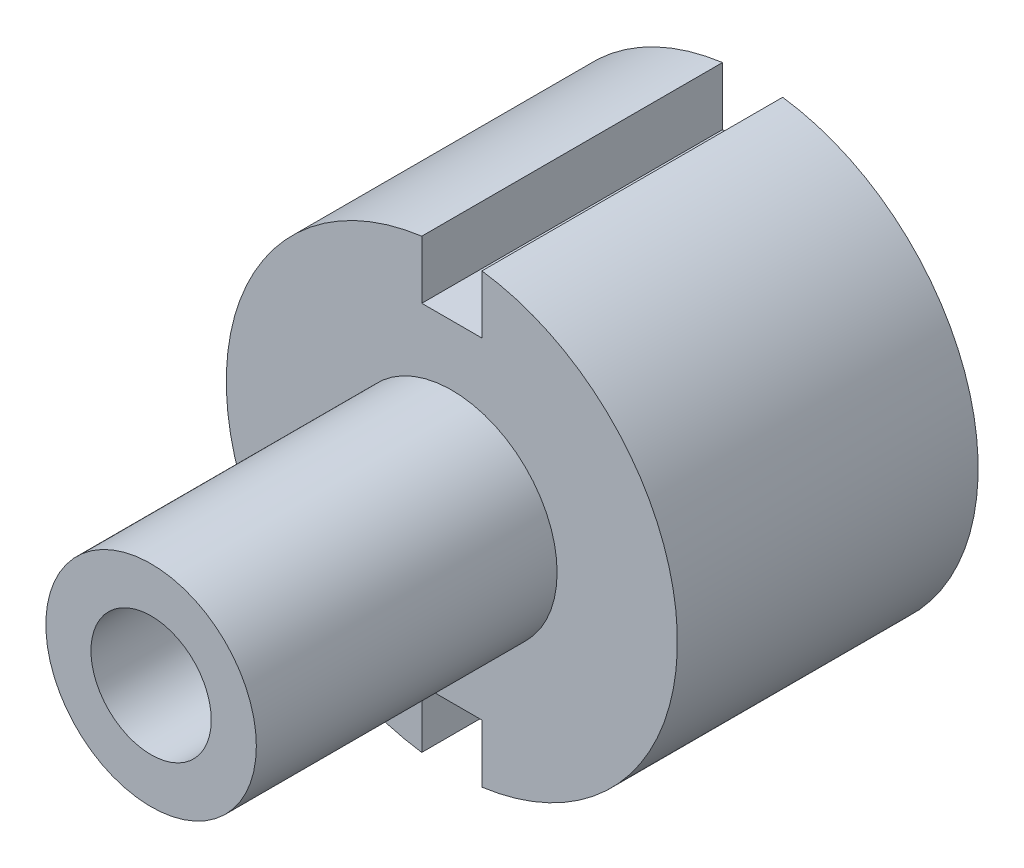
ISO-10303-21;
HEADER;
FILE_DESCRIPTION(('STEP AP214'),'2;1');
FILE_NAME('part.step','',(''),(''),'','','');
FILE_SCHEMA(('AUTOMOTIVE_DESIGN { 1 0 10303 214 1 1 1 1 }'));
ENDSEC;
DATA;
#1=APPLICATION_CONTEXT('core data for automotive mechanical design processes');
#2=APPLICATION_PROTOCOL_DEFINITION('international standard','automotive_design',2000,#1);
#3=PRODUCT_CONTEXT('',#1,'mechanical');
#4=PRODUCT('Part','Part','',(#3));
#5=PRODUCT_RELATED_PRODUCT_CATEGORY('part','',(#4));
#6=PRODUCT_DEFINITION_FORMATION('','',#4);
#7=PRODUCT_DEFINITION_CONTEXT('part definition',#1,'design');
#8=PRODUCT_DEFINITION('design','',#6,#7);
#9=PRODUCT_DEFINITION_SHAPE('','',#8);
#10=(LENGTH_UNIT() NAMED_UNIT(*) SI_UNIT(.MILLI.,.METRE.));
#11=(NAMED_UNIT(*) PLANE_ANGLE_UNIT() SI_UNIT($,.RADIAN.));
#12=(NAMED_UNIT(*) SI_UNIT($,.STERADIAN.) SOLID_ANGLE_UNIT());
#13=UNCERTAINTY_MEASURE_WITH_UNIT(LENGTH_MEASURE(1.E-05),#10,'distance_accuracy_value','');
#14=(GEOMETRIC_REPRESENTATION_CONTEXT(3) GLOBAL_UNCERTAINTY_ASSIGNED_CONTEXT((#13)) GLOBAL_UNIT_ASSIGNED_CONTEXT((#10,
#11,#12)) REPRESENTATION_CONTEXT('',''));
#15=CARTESIAN_POINT('',(0.,0.,0.));
#16=DIRECTION('',(0.,0.,1.));
#17=DIRECTION('',(1.,0.,0.));
#18=AXIS2_PLACEMENT_3D('',#15,#16,#17);
#19=CARTESIAN_POINT('',(0.,0.,5.));
#20=DIRECTION('',(0.,0.,-1.));
#21=DIRECTION('',(-1.,0.,0.));
#22=AXIS2_PLACEMENT_3D('',#19,#20,#21);
#23=CYLINDRICAL_SURFACE('',#22,7.5);
#24=CARTESIAN_POINT('',(0.,0.,5.));
#25=DIRECTION('',(0.,0.,1.));
#26=DIRECTION('',(1.,0.,0.));
#27=AXIS2_PLACEMENT_3D('',#24,#25,#26);
#28=CIRCLE('',#27,7.5);
#29=CARTESIAN_POINT('',(1.,-7.43303437365925,5.));
#30=VERTEX_POINT('',#29);
#31=CARTESIAN_POINT('',(1.,7.43303437365925,5.));
#32=VERTEX_POINT('',#31);
#33=EDGE_CURVE('E137',#30,#32,#28,.T.);
#34=ORIENTED_EDGE('',*,*,#33,.F.);
#35=DIRECTION('',(0.,0.,-1.));
#36=VECTOR('',#35,1.);
#37=CARTESIAN_POINT('',(1.,-7.43303437365925,5.));
#38=LINE('',#37,#36);
#39=CARTESIAN_POINT('',(1.,-7.43303437365925,-5.));
#40=VERTEX_POINT('',#39);
#41=EDGE_CURVE('E201',#30,#40,#38,.T.);
#42=ORIENTED_EDGE('',*,*,#41,.T.);
#43=CARTESIAN_POINT('',(0.,0.,-5.));
#44=DIRECTION('',(0.,0.,1.));
#45=DIRECTION('',(1.,0.,0.));
#46=AXIS2_PLACEMENT_3D('',#43,#44,#45);
#47=CIRCLE('',#46,7.5);
#48=CARTESIAN_POINT('',(1.,7.43303437365925,-5.));
#49=VERTEX_POINT('',#48);
#50=EDGE_CURVE('E129',#40,#49,#47,.T.);
#51=ORIENTED_EDGE('',*,*,#50,.T.);
#52=DIRECTION('',(0.,0.,-1.));
#53=VECTOR('',#52,1.);
#54=CARTESIAN_POINT('',(1.,7.43303437365925,5.));
#55=LINE('',#54,#53);
#56=EDGE_CURVE('E163',#49,#32,#55,.F.);
#57=ORIENTED_EDGE('',*,*,#56,.T.);
#58=EDGE_LOOP('',(#34,#42,#51,#57));
#59=FACE_BOUND('',#58,.T.);
#60=ADVANCED_FACE('F33',(#59),#23,.T.);
#61=CARTESIAN_POINT('',(-1.,7.43303437365925,-5.));
#62=VERTEX_POINT('',#61);
#63=CARTESIAN_POINT('',(-0.999999999999999,-7.43303437365925,-5.));
#64=VERTEX_POINT('',#63);
#65=EDGE_CURVE('E133',#62,#64,#47,.T.);
#66=ORIENTED_EDGE('',*,*,#65,.T.);
#67=DIRECTION('',(0.,0.,-1.));
#68=VECTOR('',#67,1.);
#69=CARTESIAN_POINT('',(-0.999999999999999,-7.43303437365925,5.));
#70=LINE('',#69,#68);
#71=CARTESIAN_POINT('',(-0.999999999999999,-7.43303437365925,5.));
#72=VERTEX_POINT('',#71);
#73=EDGE_CURVE('E212',#64,#72,#70,.F.);
#74=ORIENTED_EDGE('',*,*,#73,.T.);
#75=CARTESIAN_POINT('',(-1.,7.43303437365925,5.));
#76=VERTEX_POINT('',#75);
#77=EDGE_CURVE('E143',#76,#72,#28,.T.);
#78=ORIENTED_EDGE('',*,*,#77,.F.);
#79=DIRECTION('',(0.,0.,-1.));
#80=VECTOR('',#79,1.);
#81=CARTESIAN_POINT('',(-1.,7.43303437365925,5.));
#82=LINE('',#81,#80);
#83=EDGE_CURVE('E154',#76,#62,#82,.T.);
#84=ORIENTED_EDGE('',*,*,#83,.T.);
#85=EDGE_LOOP('',(#66,#74,#78,#84));
#86=FACE_BOUND('',#85,.T.);
#87=ADVANCED_FACE('F35',(#86),#23,.T.);
#88=CARTESIAN_POINT('',(0.,0.,5.));
#89=DIRECTION('',(0.,0.,1.));
#90=DIRECTION('',(1.,0.,0.));
#91=AXIS2_PLACEMENT_3D('',#88,#89,#90);
#92=PLANE('',#91);
#93=DIRECTION('',(0.,1.,0.));
#94=VECTOR('',#93,1.);
#95=CARTESIAN_POINT('',(1.,-7.5,5.));
#96=LINE('',#95,#94);
#97=CARTESIAN_POINT('',(1.,-5.5,5.));
#98=VERTEX_POINT('',#97);
#99=EDGE_CURVE('E115',#30,#98,#96,.T.);
#100=ORIENTED_EDGE('',*,*,#99,.F.);
#101=ORIENTED_EDGE('',*,*,#33,.T.);
#102=DIRECTION('',(0.,1.,0.));
#103=VECTOR('',#102,1.);
#104=CARTESIAN_POINT('',(1.,7.5,5.));
#105=LINE('',#104,#103);
#106=CARTESIAN_POINT('',(1.,5.5,5.));
#107=VERTEX_POINT('',#106);
#108=EDGE_CURVE('E210',#107,#32,#105,.T.);
#109=ORIENTED_EDGE('',*,*,#108,.F.);
#110=DIRECTION('',(1.,0.,0.));
#111=VECTOR('',#110,1.);
#112=CARTESIAN_POINT('',(-1.,5.5,5.));
#113=LINE('',#112,#111);
#114=CARTESIAN_POINT('',(-1.,5.5,5.));
#115=VERTEX_POINT('',#114);
#116=EDGE_CURVE('E208',#115,#107,#113,.T.);
#117=ORIENTED_EDGE('',*,*,#116,.F.);
#118=DIRECTION('',(0.,-1.,0.));
#119=VECTOR('',#118,1.);
#120=CARTESIAN_POINT('',(-1.,7.5,5.));
#121=LINE('',#120,#119);
#122=EDGE_CURVE('E206',#76,#115,#121,.T.);
#123=ORIENTED_EDGE('',*,*,#122,.F.);
#124=ORIENTED_EDGE('',*,*,#77,.T.);
#125=DIRECTION('',(0.,-1.,0.));
#126=VECTOR('',#125,1.);
#127=CARTESIAN_POINT('',(-0.999999999999999,-7.5,5.));
#128=LINE('',#127,#126);
#129=CARTESIAN_POINT('',(-0.999999999999999,-5.5,5.));
#130=VERTEX_POINT('',#129);
#131=EDGE_CURVE('E125',#130,#72,#128,.T.);
#132=ORIENTED_EDGE('',*,*,#131,.F.);
#133=DIRECTION('',(-1.,0.,0.));
#134=VECTOR('',#133,1.);
#135=CARTESIAN_POINT('',(1.,-5.5,5.));
#136=LINE('',#135,#134);
#137=EDGE_CURVE('E223',#98,#130,#136,.T.);
#138=ORIENTED_EDGE('',*,*,#137,.F.);
#139=EDGE_LOOP('',(#100,#101,#109,#117,#123,#124,#132,#138));
#140=FACE_BOUND('',#139,.T.);
#141=CARTESIAN_POINT('',(0.,0.,5.));
#142=DIRECTION('',(0.,0.,1.));
#143=DIRECTION('',(1.,0.,0.));
#144=AXIS2_PLACEMENT_3D('',#141,#142,#143);
#145=CIRCLE('',#144,3.5);
#146=CARTESIAN_POINT('',(3.5,0.,5.));
#147=VERTEX_POINT('',#146);
#148=EDGE_CURVE('E139',#147,#147,#145,.T.);
#149=ORIENTED_EDGE('',*,*,#148,.F.);
#150=EDGE_LOOP('',(#149));
#151=FACE_BOUND('',#150,.T.);
#152=ADVANCED_FACE('F188',(#140,#151),#92,.T.);
#153=CARTESIAN_POINT('',(0.,0.,-5.));
#154=DIRECTION('',(0.,0.,1.));
#155=DIRECTION('',(1.,0.,0.));
#156=AXIS2_PLACEMENT_3D('',#153,#154,#155);
#157=PLANE('',#156);
#158=ORIENTED_EDGE('',*,*,#50,.F.);
#159=DIRECTION('',(0.,1.,0.));
#160=VECTOR('',#159,1.);
#161=CARTESIAN_POINT('',(1.,0.,-5.));
#162=LINE('',#161,#160);
#163=CARTESIAN_POINT('',(1.,-5.5,-5.));
#164=VERTEX_POINT('',#163);
#165=EDGE_CURVE('E11',#40,#164,#162,.T.);
#166=ORIENTED_EDGE('',*,*,#165,.T.);
#167=DIRECTION('',(-1.,0.,0.));
#168=VECTOR('',#167,1.);
#169=CARTESIAN_POINT('',(1.,-5.5,-5.));
#170=LINE('',#169,#168);
#171=CARTESIAN_POINT('',(-0.999999999999999,-5.5,-5.));
#172=VERTEX_POINT('',#171);
#173=EDGE_CURVE('E122',#164,#172,#170,.T.);
#174=ORIENTED_EDGE('',*,*,#173,.T.);
#175=DIRECTION('',(0.,-1.,0.));
#176=VECTOR('',#175,1.);
#177=CARTESIAN_POINT('',(-0.999999999999999,-7.5,-5.));
#178=LINE('',#177,#176);
#179=EDGE_CURVE('E48',#172,#64,#178,.T.);
#180=ORIENTED_EDGE('',*,*,#179,.T.);
#181=ORIENTED_EDGE('',*,*,#65,.F.);
#182=DIRECTION('',(0.,-1.,0.));
#183=VECTOR('',#182,1.);
#184=CARTESIAN_POINT('',(-1.,0.,-5.));
#185=LINE('',#184,#183);
#186=CARTESIAN_POINT('',(-1.,5.5,-5.));
#187=VERTEX_POINT('',#186);
#188=EDGE_CURVE('E41',#62,#187,#185,.T.);
#189=ORIENTED_EDGE('',*,*,#188,.T.);
#190=DIRECTION('',(1.,0.,0.));
#191=VECTOR('',#190,1.);
#192=CARTESIAN_POINT('',(-1.,5.5,-5.));
#193=LINE('',#192,#191);
#194=CARTESIAN_POINT('',(1.,5.5,-5.));
#195=VERTEX_POINT('',#194);
#196=EDGE_CURVE('E150',#187,#195,#193,.T.);
#197=ORIENTED_EDGE('',*,*,#196,.T.);
#198=DIRECTION('',(0.,1.,0.));
#199=VECTOR('',#198,1.);
#200=CARTESIAN_POINT('',(1.,7.5,-5.));
#201=LINE('',#200,#199);
#202=EDGE_CURVE('E56',#195,#49,#201,.T.);
#203=ORIENTED_EDGE('',*,*,#202,.T.);
#204=EDGE_LOOP('',(#158,#166,#174,#180,#181,#189,#197,#203));
#205=FACE_BOUND('',#204,.T.);
#206=ADVANCED_FACE('F128',(#205),#157,.F.);
#207=CARTESIAN_POINT('',(0.,0.,15.));
#208=DIRECTION('',(0.,0.,-1.));
#209=DIRECTION('',(-1.,0.,0.));
#210=AXIS2_PLACEMENT_3D('',#207,#208,#209);
#211=CYLINDRICAL_SURFACE('',#210,3.5);
#212=CARTESIAN_POINT('',(0.,0.,15.));
#213=DIRECTION('',(0.,0.,1.));
#214=DIRECTION('',(1.,0.,0.));
#215=AXIS2_PLACEMENT_3D('',#212,#213,#214);
#216=CIRCLE('',#215,3.5);
#217=CARTESIAN_POINT('',(3.5,0.,15.));
#218=VERTEX_POINT('',#217);
#219=EDGE_CURVE('E134',#218,#218,#216,.T.);
#220=ORIENTED_EDGE('',*,*,#219,.F.);
#221=EDGE_LOOP('',(#220));
#222=FACE_BOUND('',#221,.T.);
#223=ORIENTED_EDGE('',*,*,#148,.T.);
#224=EDGE_LOOP('',(#223));
#225=FACE_BOUND('',#224,.T.);
#226=ADVANCED_FACE('F186',(#222,#225),#211,.T.);
#227=CARTESIAN_POINT('',(0.,0.,15.));
#228=DIRECTION('',(0.,0.,1.));
#229=DIRECTION('',(1.,0.,0.));
#230=AXIS2_PLACEMENT_3D('',#227,#228,#229);
#231=PLANE('',#230);
#232=CARTESIAN_POINT('',(0.,0.,15.));
#233=DIRECTION('',(0.,0.,1.));
#234=DIRECTION('',(1.,0.,0.));
#235=AXIS2_PLACEMENT_3D('',#232,#233,#234);
#236=CIRCLE('',#235,2.);
#237=CARTESIAN_POINT('',(2.,0.,15.));
#238=VERTEX_POINT('',#237);
#239=EDGE_CURVE('E178',#238,#238,#236,.T.);
#240=ORIENTED_EDGE('',*,*,#239,.F.);
#241=EDGE_LOOP('',(#240));
#242=FACE_BOUND('',#241,.T.);
#243=ORIENTED_EDGE('',*,*,#219,.T.);
#244=EDGE_LOOP('',(#243));
#245=FACE_BOUND('',#244,.T.);
#246=ADVANCED_FACE('F259',(#242,#245),#231,.T.);
#247=CARTESIAN_POINT('',(0.,0.,12.));
#248=DIRECTION('',(0.,0.,1.));
#249=DIRECTION('',(1.,0.,0.));
#250=AXIS2_PLACEMENT_3D('',#247,#248,#249);
#251=CYLINDRICAL_SURFACE('',#250,2.);
#252=DIRECTION('',(0.,0.,-1.));
#253=VECTOR('',#252,1.);
#254=CARTESIAN_POINT('',(-1.26392246597645,1.55,15.));
#255=LINE('',#254,#253);
#256=CARTESIAN_POINT('',(-1.26392246597645,1.55,12.));
#257=VERTEX_POINT('',#256);
#258=CARTESIAN_POINT('',(-1.26392246597645,1.55,5.));
#259=VERTEX_POINT('',#258);
#260=EDGE_CURVE('E176',#257,#259,#255,.T.);
#261=ORIENTED_EDGE('',*,*,#260,.F.);
#262=CARTESIAN_POINT('',(0.,0.,12.));
#263=DIRECTION('',(0.,0.,1.));
#264=DIRECTION('',(1.,0.,0.));
#265=AXIS2_PLACEMENT_3D('',#262,#263,#264);
#266=CIRCLE('',#265,2.);
#267=CARTESIAN_POINT('',(1.26392246597645,1.55,12.));
#268=VERTEX_POINT('',#267);
#269=EDGE_CURVE('E179',#268,#257,#266,.T.);
#270=ORIENTED_EDGE('',*,*,#269,.F.);
#271=DIRECTION('',(0.,0.,-1.));
#272=VECTOR('',#271,1.);
#273=CARTESIAN_POINT('',(1.26392246597645,1.55,15.));
#274=LINE('',#273,#272);
#275=CARTESIAN_POINT('',(1.26392246597645,1.55,5.));
#276=VERTEX_POINT('',#275);
#277=EDGE_CURVE('E174',#268,#276,#274,.T.);
#278=ORIENTED_EDGE('',*,*,#277,.T.);
#279=CARTESIAN_POINT('',(0.,0.,5.));
#280=DIRECTION('',(0.,0.,1.));
#281=DIRECTION('',(1.,0.,0.));
#282=AXIS2_PLACEMENT_3D('',#279,#280,#281);
#283=CIRCLE('',#282,2.);
#284=EDGE_CURVE('E166',#259,#276,#283,.T.);
#285=ORIENTED_EDGE('',*,*,#284,.F.);
#286=EDGE_LOOP('',(#261,#270,#278,#285));
#287=FACE_BOUND('',#286,.T.);
#288=ORIENTED_EDGE('',*,*,#239,.T.);
#289=EDGE_LOOP('',(#288));
#290=FACE_BOUND('',#289,.T.);
#291=ADVANCED_FACE('F255',(#287,#290),#251,.F.);
#292=CARTESIAN_POINT('',(0.,0.,12.));
#293=DIRECTION('',(0.,0.,1.));
#294=DIRECTION('',(1.,0.,0.));
#295=AXIS2_PLACEMENT_3D('',#292,#293,#294);
#296=PLANE('',#295);
#297=DIRECTION('',(-1.,0.,0.));
#298=VECTOR('',#297,1.);
#299=CARTESIAN_POINT('',(0.,1.55,12.));
#300=LINE('',#299,#298);
#301=EDGE_CURVE('E145',#268,#257,#300,.T.);
#302=ORIENTED_EDGE('',*,*,#301,.F.);
#303=ORIENTED_EDGE('',*,*,#269,.T.);
#304=EDGE_LOOP('',(#302,#303));
#305=FACE_BOUND('',#304,.T.);
#306=ADVANCED_FACE('F251',(#305),#296,.T.);
#307=CARTESIAN_POINT('',(0.,1.55,15.));
#308=DIRECTION('',(0.,1.,0.));
#309=DIRECTION('',(0.,0.,1.));
#310=AXIS2_PLACEMENT_3D('',#307,#308,#309);
#311=PLANE('',#310);
#312=ORIENTED_EDGE('',*,*,#301,.T.);
#313=ORIENTED_EDGE('',*,*,#260,.T.);
#314=DIRECTION('',(1.,0.,0.));
#315=VECTOR('',#314,1.);
#316=CARTESIAN_POINT('',(0.,1.55,5.));
#317=LINE('',#316,#315);
#318=EDGE_CURVE('E162',#259,#276,#317,.T.);
#319=ORIENTED_EDGE('',*,*,#318,.T.);
#320=ORIENTED_EDGE('',*,*,#277,.F.);
#321=EDGE_LOOP('',(#312,#313,#319,#320));
#322=FACE_BOUND('',#321,.T.);
#323=ADVANCED_FACE('F247',(#322),#311,.F.);
#324=CARTESIAN_POINT('',(0.,0.,5.));
#325=DIRECTION('',(0.,0.,1.));
#326=DIRECTION('',(1.,0.,0.));
#327=AXIS2_PLACEMENT_3D('',#324,#325,#326);
#328=PLANE('',#327);
#329=ORIENTED_EDGE('',*,*,#318,.F.);
#330=ORIENTED_EDGE('',*,*,#284,.T.);
#331=EDGE_LOOP('',(#329,#330));
#332=FACE_BOUND('',#331,.T.);
#333=ADVANCED_FACE('F244',(#332),#328,.T.);
#334=CARTESIAN_POINT('',(-1.,7.5,-5.));
#335=DIRECTION('',(-1.,0.,0.));
#336=DIRECTION('',(0.,0.,1.));
#337=AXIS2_PLACEMENT_3D('',#334,#335,#336);
#338=PLANE('',#337);
#339=ORIENTED_EDGE('',*,*,#122,.T.);
#340=DIRECTION('',(0.,0.,1.));
#341=VECTOR('',#340,1.);
#342=CARTESIAN_POINT('',(-1.,5.5,-5.));
#343=LINE('',#342,#341);
#344=EDGE_CURVE('E157',#187,#115,#343,.T.);
#345=ORIENTED_EDGE('',*,*,#344,.F.);
#346=ORIENTED_EDGE('',*,*,#188,.F.);
#347=ORIENTED_EDGE('',*,*,#83,.F.);
#348=EDGE_LOOP('',(#339,#345,#346,#347));
#349=FACE_BOUND('',#348,.T.);
#350=ADVANCED_FACE('F153',(#349),#338,.F.);
#351=CARTESIAN_POINT('',(1.,7.5,-5.));
#352=DIRECTION('',(1.,0.,0.));
#353=DIRECTION('',(0.,0.,-1.));
#354=AXIS2_PLACEMENT_3D('',#351,#352,#353);
#355=PLANE('',#354);
#356=ORIENTED_EDGE('',*,*,#202,.F.);
#357=DIRECTION('',(0.,0.,1.));
#358=VECTOR('',#357,1.);
#359=CARTESIAN_POINT('',(1.,5.5,-5.));
#360=LINE('',#359,#358);
#361=EDGE_CURVE('E168',#195,#107,#360,.T.);
#362=ORIENTED_EDGE('',*,*,#361,.T.);
#363=ORIENTED_EDGE('',*,*,#108,.T.);
#364=ORIENTED_EDGE('',*,*,#56,.F.);
#365=EDGE_LOOP('',(#356,#362,#363,#364));
#366=FACE_BOUND('',#365,.T.);
#367=ADVANCED_FACE('F237',(#366),#355,.F.);
#368=CARTESIAN_POINT('',(-1.,5.5,-5.));
#369=DIRECTION('',(0.,-1.,0.));
#370=DIRECTION('',(1.,0.,0.));
#371=AXIS2_PLACEMENT_3D('',#368,#369,#370);
#372=PLANE('',#371);
#373=ORIENTED_EDGE('',*,*,#116,.T.);
#374=ORIENTED_EDGE('',*,*,#361,.F.);
#375=ORIENTED_EDGE('',*,*,#196,.F.);
#376=ORIENTED_EDGE('',*,*,#344,.T.);
#377=EDGE_LOOP('',(#373,#374,#375,#376));
#378=FACE_BOUND('',#377,.T.);
#379=ADVANCED_FACE('F234',(#378),#372,.F.);
#380=CARTESIAN_POINT('',(1.,-7.5,-5.));
#381=DIRECTION('',(1.,0.,0.));
#382=DIRECTION('',(0.,1.,0.));
#383=AXIS2_PLACEMENT_3D('',#380,#381,#382);
#384=PLANE('',#383);
#385=ORIENTED_EDGE('',*,*,#99,.T.);
#386=DIRECTION('',(0.,0.,1.));
#387=VECTOR('',#386,1.);
#388=CARTESIAN_POINT('',(1.,-5.5,-5.));
#389=LINE('',#388,#387);
#390=EDGE_CURVE('E110',#164,#98,#389,.T.);
#391=ORIENTED_EDGE('',*,*,#390,.F.);
#392=ORIENTED_EDGE('',*,*,#165,.F.);
#393=ORIENTED_EDGE('',*,*,#41,.F.);
#394=EDGE_LOOP('',(#385,#391,#392,#393));
#395=FACE_BOUND('',#394,.T.);
#396=ADVANCED_FACE('F112',(#395),#384,.F.);
#397=CARTESIAN_POINT('',(-0.999999999999999,-7.5,-5.));
#398=DIRECTION('',(-1.,0.,0.));
#399=DIRECTION('',(0.,0.,1.));
#400=AXIS2_PLACEMENT_3D('',#397,#398,#399);
#401=PLANE('',#400);
#402=ORIENTED_EDGE('',*,*,#179,.F.);
#403=DIRECTION('',(0.,0.,1.));
#404=VECTOR('',#403,1.);
#405=CARTESIAN_POINT('',(-0.999999999999999,-5.5,-5.));
#406=LINE('',#405,#404);
#407=EDGE_CURVE('E119',#172,#130,#406,.T.);
#408=ORIENTED_EDGE('',*,*,#407,.T.);
#409=ORIENTED_EDGE('',*,*,#131,.T.);
#410=ORIENTED_EDGE('',*,*,#73,.F.);
#411=EDGE_LOOP('',(#402,#408,#409,#410));
#412=FACE_BOUND('',#411,.T.);
#413=ADVANCED_FACE('F226',(#412),#401,.F.);
#414=CARTESIAN_POINT('',(1.,-5.5,-5.));
#415=DIRECTION('',(0.,1.,0.));
#416=DIRECTION('',(0.,0.,1.));
#417=AXIS2_PLACEMENT_3D('',#414,#415,#416);
#418=PLANE('',#417);
#419=ORIENTED_EDGE('',*,*,#137,.T.);
#420=ORIENTED_EDGE('',*,*,#407,.F.);
#421=ORIENTED_EDGE('',*,*,#173,.F.);
#422=ORIENTED_EDGE('',*,*,#390,.T.);
#423=EDGE_LOOP('',(#419,#420,#421,#422));
#424=FACE_BOUND('',#423,.T.);
#425=ADVANCED_FACE('F123',(#424),#418,.F.);
#426=CLOSED_SHELL('',(#60,#87,#152,#206,#226,#246,#291,#306,#323,#333,#350,#367,#379,#396,#413,#425));
#427=MANIFOLD_SOLID_BREP('B2',#426);
#428=ADVANCED_BREP_SHAPE_REPRESENTATION('',(#18,#427),#14);
#429=SHAPE_DEFINITION_REPRESENTATION(#9,#428);
ENDSEC;
END-ISO-10303-21;
